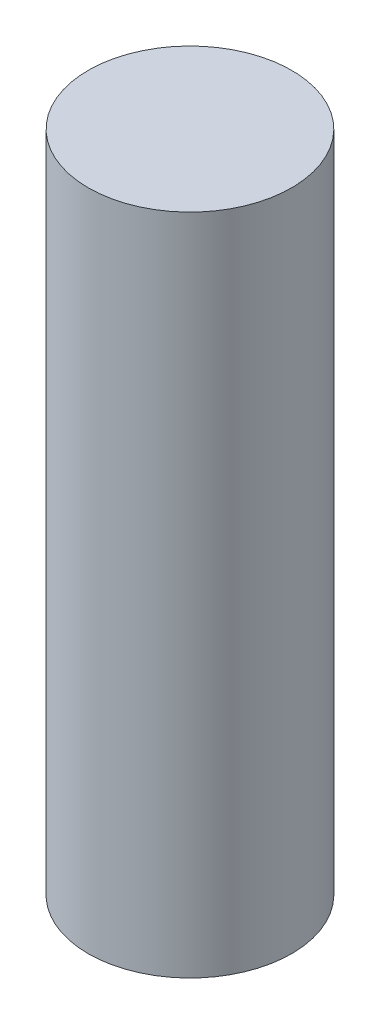
ISO-10303-21;
HEADER;
FILE_DESCRIPTION(('STEP AP214'),'2;1');
FILE_NAME('part.step','',(''),(''),'','','');
FILE_SCHEMA(('AUTOMOTIVE_DESIGN { 1 0 10303 214 1 1 1 1 }'));
ENDSEC;
DATA;
#1=APPLICATION_CONTEXT('core data for automotive mechanical design processes');
#2=APPLICATION_PROTOCOL_DEFINITION('international standard','automotive_design',2000,#1);
#3=PRODUCT_CONTEXT('',#1,'mechanical');
#4=PRODUCT('Part','Part','',(#3));
#5=PRODUCT_RELATED_PRODUCT_CATEGORY('part','',(#4));
#6=PRODUCT_DEFINITION_FORMATION('','',#4);
#7=PRODUCT_DEFINITION_CONTEXT('part definition',#1,'design');
#8=PRODUCT_DEFINITION('design','',#6,#7);
#9=PRODUCT_DEFINITION_SHAPE('','',#8);
#10=(LENGTH_UNIT() NAMED_UNIT(*) SI_UNIT(.MILLI.,.METRE.));
#11=(NAMED_UNIT(*) PLANE_ANGLE_UNIT() SI_UNIT($,.RADIAN.));
#12=(NAMED_UNIT(*) SI_UNIT($,.STERADIAN.) SOLID_ANGLE_UNIT());
#13=UNCERTAINTY_MEASURE_WITH_UNIT(LENGTH_MEASURE(1.E-05),#10,'distance_accuracy_value','');
#14=(GEOMETRIC_REPRESENTATION_CONTEXT(3) GLOBAL_UNCERTAINTY_ASSIGNED_CONTEXT((#13)) GLOBAL_UNIT_ASSIGNED_CONTEXT((#10,
#11,#12)) REPRESENTATION_CONTEXT('',''));
#15=CARTESIAN_POINT('',(0.,0.,0.));
#16=DIRECTION('',(0.,0.,1.));
#17=DIRECTION('',(1.,0.,0.));
#18=AXIS2_PLACEMENT_3D('',#15,#16,#17);
#19=CARTESIAN_POINT('',(0.,41.402,0.));
#20=DIRECTION('',(0.,-1.,0.));
#21=DIRECTION('',(0.,0.,-1.));
#22=AXIS2_PLACEMENT_3D('',#19,#20,#21);
#23=CYLINDRICAL_SURFACE('',#22,6.35);
#24=CARTESIAN_POINT('',(0.,41.402,0.));
#25=DIRECTION('',(0.,1.,0.));
#26=DIRECTION('',(0.,0.,1.));
#27=AXIS2_PLACEMENT_3D('',#24,#25,#26);
#28=CIRCLE('',#27,6.35);
#29=CARTESIAN_POINT('',(0.,41.402,6.35));
#30=VERTEX_POINT('',#29);
#31=EDGE_CURVE('E10',#30,#30,#28,.T.);
#32=ORIENTED_EDGE('',*,*,#31,.F.);
#33=EDGE_LOOP('',(#32));
#34=FACE_BOUND('',#33,.T.);
#35=CARTESIAN_POINT('',(0.,0.,0.));
#36=DIRECTION('',(0.,1.,0.));
#37=DIRECTION('',(0.,0.,1.));
#38=AXIS2_PLACEMENT_3D('',#35,#36,#37);
#39=CIRCLE('',#38,6.35);
#40=CARTESIAN_POINT('',(0.,0.,6.35));
#41=VERTEX_POINT('',#40);
#42=EDGE_CURVE('E35',#41,#41,#39,.T.);
#43=ORIENTED_EDGE('',*,*,#42,.T.);
#44=EDGE_LOOP('',(#43));
#45=FACE_BOUND('',#44,.T.);
#46=ADVANCED_FACE('F32',(#34,#45),#23,.T.);
#47=CARTESIAN_POINT('',(0.,41.402,0.));
#48=DIRECTION('',(0.,1.,0.));
#49=DIRECTION('',(0.,0.,1.));
#50=AXIS2_PLACEMENT_3D('',#47,#48,#49);
#51=PLANE('',#50);
#52=ORIENTED_EDGE('',*,*,#31,.T.);
#53=EDGE_LOOP('',(#52));
#54=FACE_BOUND('',#53,.T.);
#55=ADVANCED_FACE('F47',(#54),#51,.T.);
#56=CARTESIAN_POINT('',(0.,0.,0.));
#57=DIRECTION('',(0.,1.,0.));
#58=DIRECTION('',(0.,0.,1.));
#59=AXIS2_PLACEMENT_3D('',#56,#57,#58);
#60=PLANE('',#59);
#61=ORIENTED_EDGE('',*,*,#42,.F.);
#62=EDGE_LOOP('',(#61));
#63=FACE_BOUND('',#62,.T.);
#64=ADVANCED_FACE('F45',(#63),#60,.F.);
#65=CLOSED_SHELL('',(#46,#55,#64));
#66=MANIFOLD_SOLID_BREP('B2',#65);
#67=ADVANCED_BREP_SHAPE_REPRESENTATION('',(#18,#66),#14);
#68=SHAPE_DEFINITION_REPRESENTATION(#9,#67);
ENDSEC;
END-ISO-10303-21;
